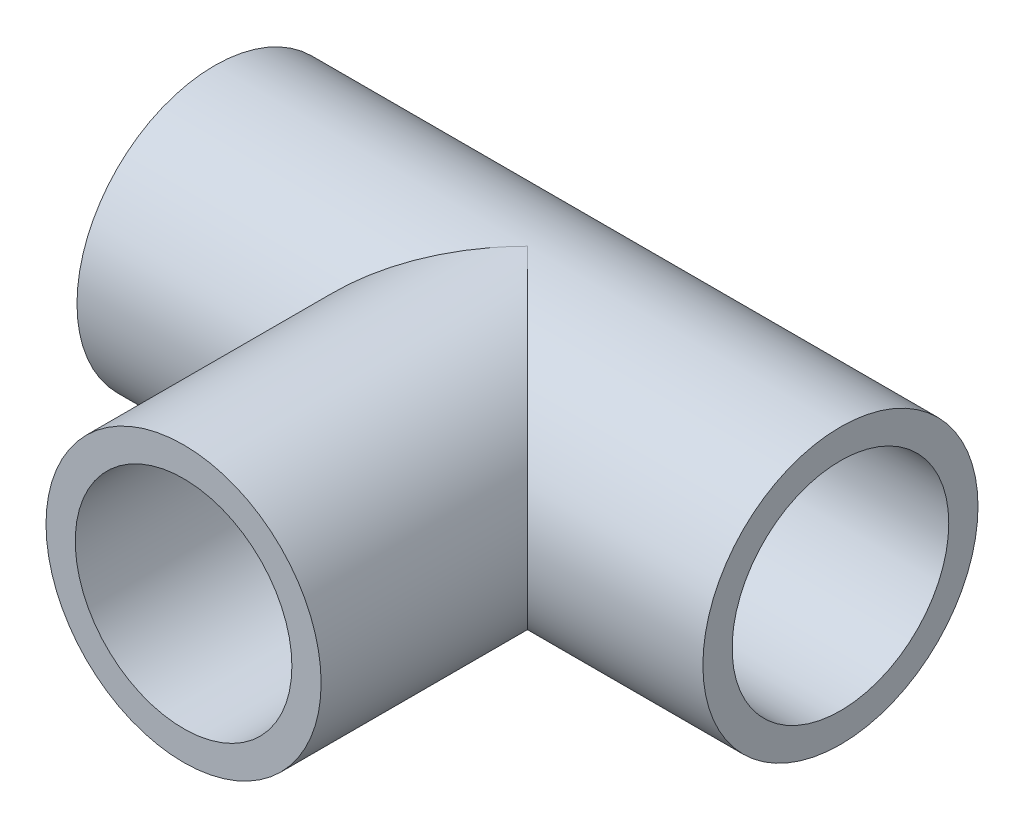
ISO-10303-21;
HEADER;
FILE_DESCRIPTION(('STEP AP214'),'2;1');
FILE_NAME('part.step','',(''),(''),'','','');
FILE_SCHEMA(('AUTOMOTIVE_DESIGN { 1 0 10303 214 1 1 1 1 }'));
ENDSEC;
DATA;
#1=APPLICATION_CONTEXT('core data for automotive mechanical design processes');
#2=APPLICATION_PROTOCOL_DEFINITION('international standard','automotive_design',2000,#1);
#3=PRODUCT_CONTEXT('',#1,'mechanical');
#4=PRODUCT('Part','Part','',(#3));
#5=PRODUCT_RELATED_PRODUCT_CATEGORY('part','',(#4));
#6=PRODUCT_DEFINITION_FORMATION('','',#4);
#7=PRODUCT_DEFINITION_CONTEXT('part definition',#1,'design');
#8=PRODUCT_DEFINITION('design','',#6,#7);
#9=PRODUCT_DEFINITION_SHAPE('','',#8);
#10=(LENGTH_UNIT() NAMED_UNIT(*) SI_UNIT(.MILLI.,.METRE.));
#11=(NAMED_UNIT(*) PLANE_ANGLE_UNIT() SI_UNIT($,.RADIAN.));
#12=(NAMED_UNIT(*) SI_UNIT($,.STERADIAN.) SOLID_ANGLE_UNIT());
#13=UNCERTAINTY_MEASURE_WITH_UNIT(LENGTH_MEASURE(1.E-05),#10,'distance_accuracy_value','');
#14=(GEOMETRIC_REPRESENTATION_CONTEXT(3) GLOBAL_UNCERTAINTY_ASSIGNED_CONTEXT((#13)) GLOBAL_UNIT_ASSIGNED_CONTEXT((#10,
#11,#12)) REPRESENTATION_CONTEXT('',''));
#15=CARTESIAN_POINT('',(0.,0.,0.));
#16=DIRECTION('',(0.,0.,1.));
#17=DIRECTION('',(1.,0.,0.));
#18=AXIS2_PLACEMENT_3D('',#15,#16,#17);
#19=CARTESIAN_POINT('',(20.828,0.,0.));
#20=DIRECTION('',(-1.,0.,0.));
#21=DIRECTION('',(0.,0.,1.));
#22=AXIS2_PLACEMENT_3D('',#19,#20,#21);
#23=CYLINDRICAL_SURFACE('',#22,10.16);
#24=CARTESIAN_POINT('',(16.7605947779187,0.,10.16));
#25=CARTESIAN_POINT('',(16.7605944002954,0.161391241346723,10.1599996176825));
#26=CARTESIAN_POINT('',(16.754433717908,0.322790789718704,10.156145885675));
#27=CARTESIAN_POINT('',(16.729876707607,0.644354415626264,10.1408250745722));
#28=CARTESIAN_POINT('',(16.7114750628537,0.80451792569744,10.1293546872003));
#29=CARTESIAN_POINT('',(16.6626623284459,1.12252662910904,10.0990634271864));
#30=CARTESIAN_POINT('',(16.6322343356812,1.28036823372443,10.0802322092615));
#31=CARTESIAN_POINT('',(16.5597694022496,1.59242770082561,10.0356680571734));
#32=CARTESIAN_POINT('',(16.5177275503003,1.74664400023374,10.0099322033027));
#33=CARTESIAN_POINT('',(16.4228159221283,2.04957272785721,9.95231063993946));
#34=CARTESIAN_POINT('',(16.3700062000217,2.19831050144942,9.92045909374325));
#35=CARTESIAN_POINT('',(16.2539936684815,2.49036401772573,9.85120576496748));
#36=CARTESIAN_POINT('',(16.1907868367667,2.63367763549333,9.81380183491171));
#37=CARTESIAN_POINT('',(15.9865342169672,3.0542380525913,9.69442704643847));
#38=CARTESIAN_POINT('',(15.8307481482798,3.32244467888381,9.60522584585825));
#39=CARTESIAN_POINT('',(15.4708402293542,3.85055170753174,9.4066394502615));
#40=CARTESIAN_POINT('',(15.2638518428047,4.10807828753814,9.2962112565507));
#41=CARTESIAN_POINT('',(14.8138166296704,4.58718468482218,9.06937617506233));
#42=CARTESIAN_POINT('',(14.570721349455,4.80871534775535,8.95296139298631));
#43=CARTESIAN_POINT('',(14.1643431841695,5.12510204253121,8.77361737739438));
#44=CARTESIAN_POINT('',(14.0119241786329,5.23335079033469,8.70929929069932));
#45=CARTESIAN_POINT('',(13.6971889095635,5.43653718615812,8.58393321715721));
#46=CARTESIAN_POINT('',(13.5348708004672,5.53147234107311,8.52288584410349));
#47=CARTESIAN_POINT('',(13.0343332511282,5.79484176371887,8.34803536945558));
#48=CARTESIAN_POINT('',(12.6817286604974,5.94246836681296,8.24214962958351));
#49=CARTESIAN_POINT('',(12.0421435793212,6.1434373378491,8.0929202724754));
#50=CARTESIAN_POINT('',(11.7618529204492,6.21130145110373,8.04047898122048));
#51=CARTESIAN_POINT('',(11.3338928922882,6.2841872291058,7.98344924427664));
#52=CARTESIAN_POINT('',(11.1900215461737,6.30366286199754,7.96804581992391));
#53=CARTESIAN_POINT('',(10.9006371515848,6.33273093121257,7.94496621148113));
#54=CARTESIAN_POINT('',(10.7551240806433,6.34232323211514,7.93729013327066));
#55=CARTESIAN_POINT('',(10.4631974061014,6.35146605269709,7.92997533906146));
#56=CARTESIAN_POINT('',(10.3167824387884,6.35098995887407,7.93035792428876));
#57=CARTESIAN_POINT('',(10.0245818271167,6.33994254000738,7.93919255196162));
#58=CARTESIAN_POINT('',(9.87879618601515,6.32937116277919,7.94764463612001));
#59=CARTESIAN_POINT('',(9.58887783318037,6.29829670156941,7.97229268493496));
#60=CARTESIAN_POINT('',(9.44474597804131,6.27778868922969,7.98849249224459));
#61=CARTESIAN_POINT('',(9.15915445883282,6.22715549257305,8.02802307805275));
#62=CARTESIAN_POINT('',(9.01769592512115,6.19702633243869,8.05135680438289));
#63=CARTESIAN_POINT('',(8.6051359888251,6.09440104307634,8.12965069095149));
#64=CARTESIAN_POINT('',(8.33884583372238,6.00888061822782,8.19356930836958));
#65=CARTESIAN_POINT('',(7.82401602555746,5.80593987351644,8.33859378955333));
#66=CARTESIAN_POINT('',(7.57548268992582,5.6885082711291,8.41970572995961));
#67=CARTESIAN_POINT('',(7.05355123131719,5.39976355554762,8.60831410121277));
#68=CARTESIAN_POINT('',(6.7841812076117,5.22248299498425,8.71790878885823));
#69=CARTESIAN_POINT('',(6.40337070990321,4.92853368468656,8.8852666243512));
#70=CARTESIAN_POINT('',(6.28022001931981,4.82578703044639,8.94159247503192));
#71=CARTESIAN_POINT('',(6.04195222798851,4.6111989706204,9.05412077032806));
#72=CARTESIAN_POINT('',(5.92683660952051,4.4993558951574,9.11032319033105));
#73=CARTESIAN_POINT('',(5.68676797594769,4.24770571332284,9.23066282125762));
#74=CARTESIAN_POINT('',(5.56333818232825,4.10633341406342,9.29457449650343));
#75=CARTESIAN_POINT('',(5.32887208907756,3.8123388470347,9.41897753475988));
#76=CARTESIAN_POINT('',(5.21783123715627,3.65972074596649,9.47947015003849));
#77=CARTESIAN_POINT('',(5.0090165783288,3.34384428111201,9.5954473310777));
#78=CARTESIAN_POINT('',(4.91124295446048,3.18058577057409,9.65093182774156));
#79=CARTESIAN_POINT('',(4.73002104724951,2.84430133269493,9.75533353671945));
#80=CARTESIAN_POINT('',(4.64657106436337,2.67127656739131,9.80425152801895));
#81=CARTESIAN_POINT('',(4.49918529128086,2.3261595753537,9.89163965210742));
#82=CARTESIAN_POINT('',(4.4344396043194,2.15452063738748,9.93053106396854));
#83=CARTESIAN_POINT('',(4.31967585346499,1.80473721131534,10.0000152729486));
#84=CARTESIAN_POINT('',(4.26965751610061,1.62659284407747,10.0306082241604));
#85=CARTESIAN_POINT('',(4.18522317840174,1.26553529914827,10.0825216877686));
#86=CARTESIAN_POINT('',(4.15078885099916,1.08262799199508,10.1038530907007));
#87=CARTESIAN_POINT('',(4.09807203434736,0.713632514413428,10.1365976997416));
#88=CARTESIAN_POINT('',(4.0797867860123,0.527544892884876,10.1480126000889));
#89=CARTESIAN_POINT('',(4.06120423516617,0.181913530792013,10.1596172702887));
#90=CARTESIAN_POINT('',(4.05863792049626,0.0225340393082187,10.1612228923538));
#91=CARTESIAN_POINT('',(4.06549330379852,-0.295864839063021,10.1569386946302));
#92=CARTESIAN_POINT('',(4.07491439840698,-0.454884243671194,10.1510492520915));
#93=CARTESIAN_POINT('',(4.10560837829651,-0.771306353489424,10.1319203683525));
#94=CARTESIAN_POINT('',(4.12688010936077,-0.92870921462572,10.1186816429509));
#95=CARTESIAN_POINT('',(4.18097894655038,-1.24075150171756,10.0851754195127));
#96=CARTESIAN_POINT('',(4.21380625647884,-1.39539087888361,10.0649077975091));
#97=CARTESIAN_POINT('',(4.28908023419266,-1.69482730394177,10.0187419959005));
#98=CARTESIAN_POINT('',(4.3310965353309,-1.83977200587618,9.99309736221845));
#99=CARTESIAN_POINT('',(4.42494488211232,-2.12535099549675,9.93628294945843));
#100=CARTESIAN_POINT('',(4.4767800533481,-2.26598389402017,9.90511141123088));
#101=CARTESIAN_POINT('',(4.64625607185008,-2.68025789445218,9.8042027366681));
#102=CARTESIAN_POINT('',(4.7779255082546,-2.94650187543813,9.7270350625769));
#103=CARTESIAN_POINT('',(5.08937981832259,-3.48026554708368,9.54988961817514));
#104=CARTESIAN_POINT('',(5.27267988718216,-3.74520130935617,9.44839565339208));
#105=CARTESIAN_POINT('',(5.67500865885085,-4.24253791443872,9.23578005976674));
#106=CARTESIAN_POINT('',(5.89407705355927,-4.47490207419688,9.12464780033797));
#107=CARTESIAN_POINT('',(6.26357689469361,-4.81227191580091,8.94912787983478));
#108=CARTESIAN_POINT('',(6.40337513277705,-4.92929374460154,8.88504236572704));
#109=CARTESIAN_POINT('',(6.69291357962594,-5.15117782003365,8.7582706179446));
#110=CARTESIAN_POINT('',(6.84265554232145,-5.25603791250305,8.6955846337463));
#111=CARTESIAN_POINT('',(7.30587546114598,-5.5513191312967,8.51245486949091));
#112=CARTESIAN_POINT('',(7.63378560760268,-5.72284228979144,8.39672091167287));
#113=CARTESIAN_POINT('',(8.25012317814324,-5.9784161274694,8.21605015419498));
#114=CARTESIAN_POINT('',(8.53241812575346,-6.07326601355795,8.14555066051495));
#115=CARTESIAN_POINT('',(8.96731976282762,-6.18562104994337,8.06013982417842));
#116=CARTESIAN_POINT('',(9.1141653414436,-6.21808248031759,8.03506235944708));
#117=CARTESIAN_POINT('',(9.41083514808231,-6.27261468980355,7.99256641735014));
#118=CARTESIAN_POINT('',(9.5606580653805,-6.2946899400828,7.97514464448399));
#119=CARTESIAN_POINT('',(9.86314440772094,-6.32819840633659,7.94858261454781));
#120=CARTESIAN_POINT('',(10.0158195072556,-6.33956671220491,7.93949287863959));
#121=CARTESIAN_POINT('',(10.3218667909336,-6.35122619446112,7.93016922910681));
#122=CARTESIAN_POINT('',(10.475238972,-6.35151741969602,7.92993527643055));
#123=CARTESIAN_POINT('',(10.781401440286,-6.34101513117587,7.93833550030994));
#124=CARTESIAN_POINT('',(10.9341915365687,-6.33021824981792,7.94697237105067));
#125=CARTESIAN_POINT('',(11.2378730912249,-6.29773235746428,7.97274067510701));
#126=CARTESIAN_POINT('',(11.3887645763547,-6.27604350014175,7.98987198857582));
#127=CARTESIAN_POINT('',(11.6754423635196,-6.22431742718677,8.03022119494464));
#128=CARTESIAN_POINT('',(11.8114631058511,-6.19509755964247,8.05283455008727));
#129=CARTESIAN_POINT('',(12.0802812854454,-6.1281200808411,8.10391967182224));
#130=CARTESIAN_POINT('',(12.2130776341322,-6.090359629416,8.13239338699092));
#131=CARTESIAN_POINT('',(12.6057142859988,-5.96484525565344,8.2253926541525));
#132=CARTESIAN_POINT('',(12.859937690259,-5.86483336173181,8.29751675478487));
#133=CARTESIAN_POINT('',(13.3854607103112,-5.61861302078057,8.46652949023568));
#134=CARTESIAN_POINT('',(13.6539042674337,-5.46781275954176,8.56549168966964));
#135=CARTESIAN_POINT('',(14.1644197248989,-5.13077722508097,8.77152911320647));
#136=CARTESIAN_POINT('',(14.4064700539576,-4.94451330365353,8.8786108540512));
#137=CARTESIAN_POINT('',(14.7702431225793,-4.62053171098508,9.04959702425712));
#138=CARTESIAN_POINT('',(14.9013442844851,-4.49323140800151,9.11362506927255));
#139=CARTESIAN_POINT('',(15.1524639157932,-4.22736220580114,9.23994807162966));
#140=CARTESIAN_POINT('',(15.2724856618162,-4.08879666110763,9.30224353753071));
#141=CARTESIAN_POINT('',(15.5008128676219,-3.80078678819659,9.42359083700067));
#142=CARTESIAN_POINT('',(15.6091085278049,-3.65133353283941,9.48263993757445));
#143=CARTESIAN_POINT('',(15.8130158243963,-3.34224791318371,9.59594016046553));
#144=CARTESIAN_POINT('',(15.9086261967212,-3.18261453678374,9.65019080443936));
#145=CARTESIAN_POINT('',(16.0863573451109,-2.85363662548469,9.75254281785507));
#146=CARTESIAN_POINT('',(16.1684492081333,-2.68427229492055,9.80063095962985));
#147=CARTESIAN_POINT('',(16.3178099966011,-2.33729619608138,9.88911890965295));
#148=CARTESIAN_POINT('',(16.3850874833653,-2.15968926349613,9.92952315662061));
#149=CARTESIAN_POINT('',(16.5036899737333,-1.79800230102854,10.0013342695171));
#150=CARTESIAN_POINT('',(16.5550579232795,-1.61394121724527,10.0327653392055));
#151=CARTESIAN_POINT('',(16.6411526349932,-1.24067876491441,10.0857222982776));
#152=CARTESIAN_POINT('',(16.6758916709649,-1.0514812968703,10.1072554928168));
#153=CARTESIAN_POINT('',(16.7214552764103,-0.718449212772744,10.1355728878625));
#154=CARTESIAN_POINT('',(16.7361161659047,-0.575325298199017,10.1447160847014));
#155=CARTESIAN_POINT('',(16.7556863869943,-0.28813650079463,10.1569299993426));
#156=CARTESIAN_POINT('',(16.7605951150175,-0.144071560276414,10.1600003412891));
#157=CARTESIAN_POINT('',(16.7605947779187,0.,10.16));
#158=B_SPLINE_CURVE_WITH_KNOTS('',3,(#24,#25,#26,#27,#28,#29,#30,#31,#32,#33,#34,#35,#36,#37,
#38,#39,#40,#41,#42,#43,#44,#45,#46,#47,#48,#49,#50,#51,#52,#53,#54,#55,#56,#57,#58,#59,#60,#61,
#62,#63,#64,#65,#66,#67,#68,#69,#70,#71,#72,#73,#74,#75,#76,#77,#78,#79,#80,#81,#82,#83,#84,#85,
#86,#87,#88,#89,#90,#91,#92,#93,#94,#95,#96,#97,#98,#99,#100,#101,#102,#103,#104,#105,#106,#107,
#108,#109,#110,#111,#112,#113,#114,#115,#116,#117,#118,#119,#120,#121,#122,#123,#124,#125,#126,
#127,#128,#129,#130,#131,#132,#133,#134,#135,#136,#137,#138,#139,#140,#141,#142,#143,#144,#145,
#146,#147,#148,#149,#150,#151,#152,#153,#154,#155,#156,#157),.UNSPECIFIED.,.T.,.F.,(4,2,2,2,2,2,
2,2,2,2,2,2,2,2,2,2,2,2,2,2,2,2,2,2,2,2,2,2,2,2,2,2,2,2,2,2,2,2,2,2,2,2,2,2,2,2,2,2,2,2,2,2,2,2,
2,2,2,2,2,2,2,2,2,2,2,2,4),(0.,0.484025973625351,0.96826232045046,1.45318169878329,
1.93830645513644,2.42079617209022,2.90347298848562,3.86774876601941,4.90903099379829,
5.95172341040233,6.54416958022081,7.13672654386007,8.31862658056516,9.19407742161865,
9.63158949728497,10.0691075676306,10.5077822612934,10.9464592225651,11.3853539812749,
11.8244303428982,12.6815916946961,13.539056499885,14.5567015281642,15.0663286950033,
15.5760496288253,16.1700980830477,16.7639275315077,17.3577651717479,17.9515323025682,
18.5132659340585,19.0749891340869,19.6360500102143,20.1970150099922,20.6746305516963,
21.1522220544713,21.6297670493825,22.1073204670681,22.5660424697461,23.0249107412796,
23.9419418966557,24.9515376454097,25.9622614475361,26.5414175872914,27.1206761546068,
28.2773168859333,29.1914991123514,29.6484015804187,30.1051071752465,30.5645640237038,
31.0240188460766,31.4836132521631,31.9432011740874,32.3656077955231,32.7881550952005,
33.6328360716765,34.5998026784322,35.5675537587651,36.1478805541708,36.728035170483,
37.3086709450476,37.8893645363359,38.471284407909,39.0528670966358,39.6328659052805,
40.2124359540585,40.6444920006926,41.0765747869245),.UNSPECIFIED.);
#159=CARTESIAN_POINT('',(16.7605947779187,0.,10.16));
#160=VERTEX_POINT('',#159);
#161=EDGE_CURVE('E63',#160,#160,#158,.T.);
#162=ORIENTED_EDGE('',*,*,#161,.T.);
#163=EDGE_LOOP('',(#162));
#164=FACE_BOUND('',#163,.T.);
#165=CARTESIAN_POINT('',(4.12960723085499,0.,10.16));
#166=CARTESIAN_POINT('',(4.12960802116777,-0.15993577458811,10.1599992390968));
#167=CARTESIAN_POINT('',(4.13572457852729,-0.319888660713194,10.1562147263093));
#168=CARTESIAN_POINT('',(4.16010805356437,-0.638574802455996,10.1411680558022));
#169=CARTESIAN_POINT('',(4.17838075299075,-0.797307441337451,10.1299023398499));
#170=CARTESIAN_POINT('',(4.22685766606973,-1.11250294598901,10.1001501666463));
#171=CARTESIAN_POINT('',(4.25708030017271,-1.26896191911489,10.081652562161));
#172=CARTESIAN_POINT('',(4.32906294842989,-1.57829292282104,10.037878741426));
#173=CARTESIAN_POINT('',(4.37082785618535,-1.73116340208831,10.012599650149));
#174=CARTESIAN_POINT('',(4.46512318553312,-2.03145228615812,9.95600380506411));
#175=CARTESIAN_POINT('',(4.51759384998898,-2.1788958116562,9.92472061991553));
#176=CARTESIAN_POINT('',(4.63287290440117,-2.4684095990622,9.85670886460573));
#177=CARTESIAN_POINT('',(4.69568529229089,-2.61047775672099,9.8199781890849));
#178=CARTESIAN_POINT('',(4.89867945715204,-3.02737042427953,9.70276878524531));
#179=CARTESIAN_POINT('',(5.05352920145414,-3.2932315284874,9.61520434179558));
#180=CARTESIAN_POINT('',(5.41119084893829,-3.81643587564488,9.42043350354484));
#181=CARTESIAN_POINT('',(5.61682451532371,-4.07144875263182,9.31222208948931));
#182=CARTESIAN_POINT('',(6.06395729915542,-4.54575291977994,9.09012110939169));
#183=CARTESIAN_POINT('',(6.30550401841802,-4.764995976501,8.9762241424571));
#184=CARTESIAN_POINT('',(6.7088295925019,-5.07757472328927,8.80117527028408));
#185=CARTESIAN_POINT('',(6.85978599883998,-5.1842857495574,8.73856563773374));
#186=CARTESIAN_POINT('',(7.17145188223699,-5.38452565653084,8.61662452149608));
#187=CARTESIAN_POINT('',(7.33216311824149,-5.47805214970037,8.55729363272336));
#188=CARTESIAN_POINT('',(7.82764622286346,-5.73739540504167,8.38751986668234));
#189=CARTESIAN_POINT('',(8.17655759577542,-5.88259218467857,8.28493329195481));
#190=CARTESIAN_POINT('',(8.81080831829488,-6.08045352993199,8.14032348131292));
#191=CARTESIAN_POINT('',(9.08973359915288,-6.14726214332176,8.08953186806262));
#192=CARTESIAN_POINT('',(9.51543606776853,-6.21854048123552,8.0346855388286));
#193=CARTESIAN_POINT('',(9.65852360928172,-6.23747650818635,8.01996117391002));
#194=CARTESIAN_POINT('',(9.94626963239794,-6.265467076094,7.99811616817104));
#195=CARTESIAN_POINT('',(10.090928137162,-6.27452147116381,7.99099563960957));
#196=CARTESIAN_POINT('',(10.3810500050463,-6.28259881206795,7.98464613684881));
#197=CARTESIAN_POINT('',(10.5265144713281,-6.28159717119417,7.98543650454074));
#198=CARTESIAN_POINT('',(10.816762541615,-6.26952401189685,7.99491884370192));
#199=CARTESIAN_POINT('',(10.9615461421088,-6.25845244159817,8.00361085587642));
#200=CARTESIAN_POINT('',(11.249422845616,-6.22640764557374,8.02856518489811));
#201=CARTESIAN_POINT('',(11.3925150947926,-6.20542962075053,8.04483117083895));
#202=CARTESIAN_POINT('',(11.6760064858361,-6.15388739364835,8.0843251288713));
#203=CARTESIAN_POINT('',(11.8164044922234,-6.12331923987617,8.10755597056954));
#204=CARTESIAN_POINT('',(12.2266234882066,-6.01923565790584,8.18546677475882));
#205=CARTESIAN_POINT('',(12.4915811585379,-5.93263090176895,8.24895472372877));
#206=CARTESIAN_POINT('',(13.0036254610711,-5.72741982425269,8.39272839475857));
#207=CARTESIAN_POINT('',(13.2507056770571,-5.60880208495449,8.47302010783855));
#208=CARTESIAN_POINT('',(13.7685239187696,-5.31777012857931,8.65920765466185));
#209=CARTESIAN_POINT('',(14.0352729268325,-5.1394767830406,8.7670976363122));
#210=CARTESIAN_POINT('',(14.4120035748108,-4.8440761515878,8.93159121523558));
#211=CARTESIAN_POINT('',(14.5337680947526,-4.74085705778601,8.98691001917841));
#212=CARTESIAN_POINT('',(14.7692001167682,-4.52535301410151,9.09733038226723));
#213=CARTESIAN_POINT('',(14.8828661363584,-4.41306641233675,9.15243189990252));
#214=CARTESIAN_POINT('',(15.1189147224205,-4.1613491765351,9.26989727256174));
#215=CARTESIAN_POINT('',(15.2398328142571,-4.02043417609053,9.33203148110657));
#216=CARTESIAN_POINT('',(15.469312100046,-3.72756925085358,9.45282526314153));
#217=CARTESIAN_POINT('',(15.5778779096565,-3.57562348290734,9.51148613055397));
#218=CARTESIAN_POINT('',(15.7817777312319,-3.26133131016456,9.62378102802186));
#219=CARTESIAN_POINT('',(15.8771121031274,-3.09898518846117,9.67741519480415));
#220=CARTESIAN_POINT('',(16.0535091627853,-2.76478026964291,9.77814068662648));
#221=CARTESIAN_POINT('',(16.1345735734909,-2.59292262423933,9.8252328014034));
#222=CARTESIAN_POINT('',(16.2771836850689,-2.25084409594552,9.90901230216308));
#223=CARTESIAN_POINT('',(16.339576416791,-2.08108452788122,9.94613869791903));
#224=CARTESIAN_POINT('',(16.4498231431708,-1.73534935247323,10.0122488230572));
#225=CARTESIAN_POINT('',(16.4976774530629,-1.5593738800004,10.0412327289907));
#226=CARTESIAN_POINT('',(16.5780201718972,-1.20291688928445,10.0901395479062));
#227=CARTESIAN_POINT('',(16.6105258542472,-1.02244067827086,10.1100726457298));
#228=CARTESIAN_POINT('',(16.65965931931,-0.658549024399193,10.1402773173163));
#229=CARTESIAN_POINT('',(16.6762896762796,-0.475134062979127,10.1505504574815));
#230=CARTESIAN_POINT('',(16.6921257534749,-0.134005174878137,10.1603346905228));
#231=CARTESIAN_POINT('',(16.6935107457274,0.0235739619413553,10.1611917406578));
#232=CARTESIAN_POINT('',(16.6844417144483,0.338259743355267,10.1555864579262));
#233=CARTESIAN_POINT('',(16.6739882271465,0.495366409027326,10.1491244565797));
#234=CARTESIAN_POINT('',(16.6413907638156,0.807879011624514,10.1290399420582));
#235=CARTESIAN_POINT('',(16.6192478197263,0.963285097440122,10.1154180609547));
#236=CARTESIAN_POINT('',(16.563573819265,1.27127761288607,10.0813423102994));
#237=CARTESIAN_POINT('',(16.5300425366794,1.42386398644327,10.0608883050372));
#238=CARTESIAN_POINT('',(16.4533854591575,1.71989245852474,10.0144504085506));
#239=CARTESIAN_POINT('',(16.410638500995,1.86346743307218,9.98868625806985));
#240=CARTESIAN_POINT('',(16.3153938516224,2.14626276565049,9.93176714431547));
#241=CARTESIAN_POINT('',(16.2628930447239,2.28548171557925,9.90061045871333));
#242=CARTESIAN_POINT('',(16.0915154958586,2.69546838241958,9.79995083599633));
#243=CARTESIAN_POINT('',(15.9587050169343,2.958788938767,9.72322196310829));
#244=CARTESIAN_POINT('',(15.6449289318805,3.48659976541549,9.54748447078252));
#245=CARTESIAN_POINT('',(15.4604341372232,3.74847193957534,9.4470018795236));
#246=CARTESIAN_POINT('',(15.0558425607861,4.23955057319233,9.23705272134115));
#247=CARTESIAN_POINT('',(14.8357054926282,4.46871951024364,9.127576058233));
#248=CARTESIAN_POINT('',(14.4650663413843,4.8004956091764,8.95540970134675));
#249=CARTESIAN_POINT('',(14.3251931433168,4.91522831439536,8.89279186692336));
#250=CARTESIAN_POINT('',(14.0356155388867,5.13252574818702,8.76917400050083));
#251=CARTESIAN_POINT('',(13.8859094133553,5.23508834011758,8.70817425403613));
#252=CARTESIAN_POINT('',(13.4230073714705,5.5234169955918,8.53043091127508));
#253=CARTESIAN_POINT('',(13.0955569509034,5.6902466623794,8.4187135555499));
#254=CARTESIAN_POINT('',(12.4817102836626,5.93684225754477,8.24605014706339));
#255=CARTESIAN_POINT('',(12.2013551517006,6.02757230816149,8.17936064983916));
#256=CARTESIAN_POINT('',(11.7700055834142,6.13390359968503,8.09955148846309));
#257=CARTESIAN_POINT('',(11.6244480200148,6.16438379232135,8.07632175449225));
#258=CARTESIAN_POINT('',(11.330583194388,6.21503210929101,8.03741344057988));
#259=CARTESIAN_POINT('',(11.1822771163904,6.23520457249606,8.02173168360133));
#260=CARTESIAN_POINT('',(10.8831535931636,6.26499874248077,7.99848420423748));
#261=CARTESIAN_POINT('',(10.7323268787309,6.27456250080745,7.99096306281557));
#262=CARTESIAN_POINT('',(10.4301892381235,6.2827745753501,7.98450830952382));
#263=CARTESIAN_POINT('',(10.2788783130108,6.28142291549224,7.9855746788305));
#264=CARTESIAN_POINT('',(9.97699980136985,6.26782571716181,7.99625121041963));
#265=CARTESIAN_POINT('',(9.82643250614306,6.25557620484297,8.0058644892882));
#266=CARTESIAN_POINT('',(9.52731156002107,6.22039357711518,8.03323080967781));
#267=CARTESIAN_POINT('',(9.37875789237865,6.19746055061644,8.05098378345878));
#268=CARTESIAN_POINT('',(9.09525997293376,6.14328974828651,8.09238295013665));
#269=CARTESIAN_POINT('',(8.96010310921069,6.11276454235724,8.11551589857293));
#270=CARTESIAN_POINT('',(8.69309997611333,6.04318379581337,8.16746048786873));
#271=CARTESIAN_POINT('',(8.56125482920495,6.004125405344,8.19627402557819));
#272=CARTESIAN_POINT('',(8.17158499194839,5.87473223002094,8.29002307791423));
#273=CARTESIAN_POINT('',(7.91948774986839,5.77215252771415,8.36228859795936));
#274=CARTESIAN_POINT('',(7.39800154048108,5.52006345032109,8.53116212403408));
#275=CARTESIAN_POINT('',(7.13157488031945,5.36585552110056,8.6297898905785));
#276=CARTESIAN_POINT('',(6.62562728667078,5.02179582128894,8.83443352667355));
#277=CARTESIAN_POINT('',(6.38612871692734,4.83191476866301,8.9404554203654));
#278=CARTESIAN_POINT('',(6.02805361727312,4.50300295012383,9.10865613631019));
#279=CARTESIAN_POINT('',(5.89978954598249,4.37452606126018,9.1711999350601));
#280=CARTESIAN_POINT('',(5.65445444753309,4.10644901371172,9.29432095644298));
#281=CARTESIAN_POINT('',(5.53737995911015,3.96685231936399,9.35489878335398));
#282=CARTESIAN_POINT('',(5.31508916121221,3.67695767086696,9.47259624004773));
#283=CARTESIAN_POINT('',(5.20988206061768,3.52665155196317,9.52971316854455));
#284=CARTESIAN_POINT('',(5.01230202310774,3.21607054423099,9.63896176564881));
#285=CARTESIAN_POINT('',(4.91993022822562,3.05579477017761,9.69109299052015));
#286=CARTESIAN_POINT('',(4.74965985076001,2.72737472086703,9.78857210797145));
#287=CARTESIAN_POINT('',(4.67165813648672,2.55929830109852,9.83396784159516));
#288=CARTESIAN_POINT('',(4.53032877718703,2.21535857132067,9.9171093891764));
#289=CARTESIAN_POINT('',(4.46699261499644,2.03949985200669,9.95485964171766));
#290=CARTESIAN_POINT('',(4.35606457332149,1.68179538311796,10.0214854201264));
#291=CARTESIAN_POINT('',(4.3084291976547,1.4999677346275,10.0503854478968));
#292=CARTESIAN_POINT('',(4.22952588189981,1.13164187239222,10.0984862560856));
#293=CARTESIAN_POINT('',(4.19824543362725,0.945147342587661,10.1176944483876));
#294=CARTESIAN_POINT('',(4.16019700221257,0.631905103162265,10.1411110814773));
#295=CARTESIAN_POINT('',(4.14873645439083,0.50591697930005,10.1481836053463));
#296=CARTESIAN_POINT('',(4.13344102800678,0.25328950600334,10.1576285062794));
#297=CARTESIAN_POINT('',(4.12960660502124,0.126650118116068,10.1600006025449));
#298=CARTESIAN_POINT('',(4.12960723085499,0.,10.16));
#299=B_SPLINE_CURVE_WITH_KNOTS('',3,(#165,#166,#167,#168,#169,#170,#171,#172,#173,#174,#175,
#176,#177,#178,#179,#180,#181,#182,#183,#184,#185,#186,#187,#188,#189,#190,#191,#192,#193,#194,
#195,#196,#197,#198,#199,#200,#201,#202,#203,#204,#205,#206,#207,#208,#209,#210,#211,#212,#213,
#214,#215,#216,#217,#218,#219,#220,#221,#222,#223,#224,#225,#226,#227,#228,#229,#230,#231,#232,
#233,#234,#235,#236,#237,#238,#239,#240,#241,#242,#243,#244,#245,#246,#247,#248,#249,#250,#251,
#252,#253,#254,#255,#256,#257,#258,#259,#260,#261,#262,#263,#264,#265,#266,#267,#268,#269,#270,
#271,#272,#273,#274,#275,#276,#277,#278,#279,#280,#281,#282,#283,#284,#285,#286,#287,#288,#289,
#290,#291,#292,#293,#294,#295,#296,#297,#298),.UNSPECIFIED.,.T.,.F.,(4,2,2,2,2,2,2,2,2,2,2,2,2,
2,2,2,2,2,2,2,2,2,2,2,2,2,2,2,2,2,2,2,2,2,2,2,2,2,2,2,2,2,2,2,2,2,2,2,2,2,2,2,2,2,2,2,2,2,2,2,2,
2,2,2,2,2,4),(0.,0.479676638476249,0.959581585779111,1.44022919369783,1.92108089621397,
2.39931861832243,2.87774165492684,3.8334842529069,4.86469675825699,5.89728849967092,
6.48217356491417,7.06716440903563,8.23399100270853,9.10392090197776,9.53869406375882,
9.97347364420686,10.4093165061437,10.8451616133329,11.2812180789111,11.7174544526221,
12.5715999630604,13.4260505210522,14.4374262763404,14.9439106387278,15.4504874794568,
16.0371803344556,16.6236532358071,17.210110180396,17.7964962680289,18.3495812348902,
18.9026542084392,19.4551032591022,20.0074627123922,20.4796268856034,20.9517696727573,
21.4238707863326,21.8959812780882,22.3514907261601,22.8071459293411,23.7177635140872,
24.7212263048199,25.7258313284365,26.2995615143586,26.8733922784763,28.0190583997201,
28.9215194475222,29.3725800645241,29.8234506581346,30.2767721191034,30.7300925864095,
31.1835784224934,31.6370604846511,32.0580582717528,32.4791968763459,33.3210511811486,
34.2874932338286,35.2547320775156,35.8302109732734,36.4055112765644,36.9812549753752,
37.5570498687603,38.1285360437625,38.6996894853946,39.2692470839993,39.8383684476525,
40.2181926251701,40.5980394923078),.UNSPECIFIED.);
#300=CARTESIAN_POINT('',(4.12960723085499,0.,10.16));
#301=VERTEX_POINT('',#300);
#302=EDGE_CURVE('E38',#301,#301,#299,.T.);
#303=ORIENTED_EDGE('',*,*,#302,.F.);
#304=EDGE_LOOP('',(#303));
#305=FACE_BOUND('',#304,.T.);
#306=ADVANCED_FACE('F34',(#164,#305),#23,.T.);
#307=CARTESIAN_POINT('',(10.4105947779187,0.,0.));
#308=DIRECTION('',(-0.707106781186547,0.,-0.707106781186547));
#309=DIRECTION('',(-0.707106781186547,0.,0.707106781186547));
#310=AXIS2_PLACEMENT_3D('',#307,#308,#309);
#311=ELLIPSE('',#310,14.3684097937107,10.16);
#312=CARTESIAN_POINT('',(10.4105947779187,10.16,0.));
#313=VERTEX_POINT('',#312);
#314=CARTESIAN_POINT('',(10.4105947779187,-10.16,0.));
#315=VERTEX_POINT('',#314);
#316=EDGE_CURVE('E55',#313,#315,#311,.F.);
#317=ORIENTED_EDGE('',*,*,#316,.F.);
#318=CARTESIAN_POINT('',(10.4105947779187,0.,0.));
#319=DIRECTION('',(-0.707106781186547,0.,0.707106781186547));
#320=DIRECTION('',(-0.707106781186547,0.,-0.707106781186547));
#321=AXIS2_PLACEMENT_3D('',#318,#319,#320);
#322=ELLIPSE('',#321,14.3684097937107,10.16);
#323=EDGE_CURVE('E53',#315,#313,#322,.T.);
#324=ORIENTED_EDGE('',*,*,#323,.F.);
#325=EDGE_LOOP('',(#317,#324));
#326=FACE_BOUND('',#325,.T.);
#327=CARTESIAN_POINT('',(-12.7,0.,0.));
#328=DIRECTION('',(-1.,0.,0.));
#329=DIRECTION('',(0.,0.,1.));
#330=AXIS2_PLACEMENT_3D('',#327,#328,#329);
#331=CIRCLE('',#330,10.16);
#332=CARTESIAN_POINT('',(-12.7,0.,10.16));
#333=VERTEX_POINT('',#332);
#334=EDGE_CURVE('E270',#333,#333,#331,.T.);
#335=ORIENTED_EDGE('',*,*,#334,.F.);
#336=EDGE_LOOP('',(#335));
#337=FACE_BOUND('',#336,.T.);
#338=CARTESIAN_POINT('',(33.528,0.,0.));
#339=DIRECTION('',(1.,0.,0.));
#340=DIRECTION('',(0.,0.,-1.));
#341=AXIS2_PLACEMENT_3D('',#338,#339,#340);
#342=CIRCLE('',#341,10.16);
#343=CARTESIAN_POINT('',(33.528,0.,-10.16));
#344=VERTEX_POINT('',#343);
#345=EDGE_CURVE('E267',#344,#344,#342,.T.);
#346=ORIENTED_EDGE('',*,*,#345,.F.);
#347=EDGE_LOOP('',(#346));
#348=FACE_BOUND('',#347,.T.);
#349=ADVANCED_FACE('F56',(#326,#337,#348),#23,.T.);
#350=CARTESIAN_POINT('',(20.828,0.,0.));
#351=DIRECTION('',(-1.,0.,0.));
#352=DIRECTION('',(0.,0.,1.));
#353=AXIS2_PLACEMENT_3D('',#350,#351,#352);
#354=CYLINDRICAL_SURFACE('',#353,6.35);
#355=CARTESIAN_POINT('',(0.,0.,0.));
#356=DIRECTION('',(1.,0.,0.));
#357=DIRECTION('',(0.,0.,-1.));
#358=AXIS2_PLACEMENT_3D('',#355,#356,#357);
#359=CIRCLE('',#358,6.35);
#360=CARTESIAN_POINT('',(0.,0.,-6.35));
#361=VERTEX_POINT('',#360);
#362=EDGE_CURVE('E59',#361,#361,#359,.T.);
#363=ORIENTED_EDGE('',*,*,#362,.F.);
#364=EDGE_LOOP('',(#363));
#365=FACE_BOUND('',#364,.T.);
#366=CARTESIAN_POINT('',(20.828,0.,0.));
#367=DIRECTION('',(1.,0.,0.));
#368=DIRECTION('',(0.,0.,-1.));
#369=AXIS2_PLACEMENT_3D('',#366,#367,#368);
#370=CIRCLE('',#369,6.35);
#371=CARTESIAN_POINT('',(20.828,0.,-6.35));
#372=VERTEX_POINT('',#371);
#373=EDGE_CURVE('E74',#372,#372,#370,.T.);
#374=ORIENTED_EDGE('',*,*,#373,.T.);
#375=EDGE_LOOP('',(#374));
#376=FACE_BOUND('',#375,.T.);
#377=CARTESIAN_POINT('',(4.12960723085499,0.,6.35));
#378=CARTESIAN_POINT('',(4.12960230189717,-0.140706169343039,6.35000492354349));
#379=CARTESIAN_POINT('',(4.13434125138473,-0.281370670660338,6.34531732792605));
#380=CARTESIAN_POINT('',(4.15318218091358,-0.561500470905517,6.32668204986781));
#381=CARTESIAN_POINT('',(4.16728616298899,-0.700965506955592,6.31273238740469));
#382=CARTESIAN_POINT('',(4.20457439270811,-0.977553413996397,6.27585666364959));
#383=CARTESIAN_POINT('',(4.22776464079408,-1.11467467461243,6.25292467055588));
#384=CARTESIAN_POINT('',(4.28276724593203,-1.38551052363318,6.19854407736995));
#385=CARTESIAN_POINT('',(4.31458361089654,-1.51922349678794,6.16709151841242));
#386=CARTESIAN_POINT('',(4.3859901371276,-1.78136609643645,6.09651762789294));
#387=CARTESIAN_POINT('',(4.4255226189319,-1.90982685531031,6.05745319997576));
#388=CARTESIAN_POINT('',(4.51186858713966,-2.16185032496594,5.97215381573472));
#389=CARTESIAN_POINT('',(4.55868480099778,-2.28541117909847,5.925916173359));
#390=CARTESIAN_POINT('',(4.70901359422854,-2.64785151598696,5.77749684299827));
#391=CARTESIAN_POINT('',(4.82246211442324,-2.87868795156899,5.66555357391912));
#392=CARTESIAN_POINT('',(5.12147531645112,-3.40615644528569,5.37080962390625));
#393=CARTESIAN_POINT('',(5.31755677707438,-3.69107871727979,5.17775519418885));
#394=CARTESIAN_POINT('',(5.63435592719193,-4.08248969532962,4.86659672059196));
#395=CARTESIAN_POINT('',(5.74396287118116,-4.20716510655713,4.75905829214521));
#396=CARTESIAN_POINT('',(5.96968964842961,-4.44477036474707,4.53793114537696));
#397=CARTESIAN_POINT('',(6.08580944667427,-4.55770027484661,4.42434245958315));
#398=CARTESIAN_POINT('',(6.36922636823007,-4.81323825518371,4.14765891480916));
#399=CARTESIAN_POINT('',(6.53905340507692,-4.9505911190991,3.98230263963677));
#400=CARTESIAN_POINT('',(6.88735613027459,-5.20423269739055,3.64459405929871));
#401=CARTESIAN_POINT('',(7.06583615926261,-5.32051069837532,3.47223825011391));
#402=CARTESIAN_POINT('',(7.42945407972122,-5.53242515619171,3.12350157304361));
#403=CARTESIAN_POINT('',(7.61456638263112,-5.62813268383743,2.94713697016864));
#404=CARTESIAN_POINT('',(7.99142813434638,-5.80011997779812,2.59227105063422));
#405=CARTESIAN_POINT('',(8.18317377684658,-5.87641068241589,2.41377099657131));
#406=CARTESIAN_POINT('',(8.5060235161905,-5.98677296827804,2.12045836544906));
#407=CARTESIAN_POINT('',(8.63489485323799,-6.02628041691449,2.00519517117827));
#408=CARTESIAN_POINT('',(8.8979435169124,-6.09766146676561,1.77634321247573));
#409=CARTESIAN_POINT('',(9.0321517703633,-6.12947946206664,1.66277191065629));
#410=CARTESIAN_POINT('',(9.23982122922911,-6.17131619367565,1.49689606703529));
#411=CARTESIAN_POINT('',(9.31060123061234,-6.1843472526733,1.44199771358532));
#412=CARTESIAN_POINT('',(9.4549592791927,-6.20829603127628,1.33512172935476));
#413=CARTESIAN_POINT('',(9.52854290240012,-6.2192092447765,1.28315048963846));
#414=CARTESIAN_POINT('',(9.67856514647917,-6.23863806535816,1.18505553298291));
#415=CARTESIAN_POINT('',(9.75495779715437,-6.24718138456394,1.13886802768382));
#416=CARTESIAN_POINT('',(9.91281811714,-6.26172966128396,1.05593142351133));
#417=CARTESIAN_POINT('',(9.99425905303376,-6.2677468649793,1.01913713659696));
#418=CARTESIAN_POINT('',(10.1327247212293,-6.27506968559148,0.972806553362016));
#419=CARTESIAN_POINT('',(10.187942077359,-6.27729210409588,0.958225028488766));
#420=CARTESIAN_POINT('',(10.2999842143393,-6.28026155909762,0.938573838342432));
#421=CARTESIAN_POINT('',(10.3568024440951,-6.28101391362561,0.933469890796685));
#422=CARTESIAN_POINT('',(10.4705778014642,-6.28095965664953,0.933832979301359));
#423=CARTESIAN_POINT('',(10.5275348161433,-6.28014822354068,0.939332709547749));
#424=CARTESIAN_POINT('',(10.6397881616544,-6.27705727870809,0.959769701310069));
#425=CARTESIAN_POINT('',(10.6950778452174,-6.27477254143781,0.974740551603482));
#426=CARTESIAN_POINT('',(10.8641875431817,-6.26565292209063,1.03226553712139));
#427=CARTESIAN_POINT('',(10.9735675115982,-6.2565935721731,1.0868743940337));
#428=CARTESIAN_POINT('',(11.1842622369801,-6.2340674451622,1.2095117454698));
#429=CARTESIAN_POINT('',(11.2854974020646,-6.2205625215017,1.27765428796348));
#430=CARTESIAN_POINT('',(11.482714011629,-6.18960767786218,1.42006244649958));
#431=CARTESIAN_POINT('',(11.5787029039941,-6.17216354093752,1.49431898621341));
#432=CARTESIAN_POINT('',(11.7673548290123,-6.13345545794399,1.64602193463769));
#433=CARTESIAN_POINT('',(11.8600156284413,-6.11218900242054,1.7234704130412));
#434=CARTESIAN_POINT('',(12.1348378728635,-6.04265044881607,1.95844270364886));
#435=CARTESIAN_POINT('',(12.3135401787287,-5.98868767314725,2.11835985983047));
#436=CARTESIAN_POINT('',(12.6646690443486,-5.86552702108518,2.4387876820676));
#437=CARTESIAN_POINT('',(12.8371011596564,-5.79634303427215,2.59929767670036));
#438=CARTESIAN_POINT('',(13.1763150891558,-5.6423631974281,2.91849171722915));
#439=CARTESIAN_POINT('',(13.3431018787214,-5.55758154186994,3.07717728503229));
#440=CARTESIAN_POINT('',(13.6712311116324,-5.3716541467554,3.39134708068275));
#441=CARTESIAN_POINT('',(13.8325620948165,-5.27047626916382,3.54682433115028));
#442=CARTESIAN_POINT('',(14.1486369034342,-5.05122335145216,3.8526700402257));
#443=CARTESIAN_POINT('',(14.3033782768964,-4.93314209170332,4.0030365930311));
#444=CARTESIAN_POINT('',(14.6046685601964,-4.67965967386968,4.2966045073782));
#445=CARTESIAN_POINT('',(14.7512315713039,-4.54428974015066,4.43981815431882));
#446=CARTESIAN_POINT('',(15.0346223145172,-4.25559728670249,4.71725497404321));
#447=CARTESIAN_POINT('',(15.1714552714974,-4.10228452080326,4.85148296966593));
#448=CARTESIAN_POINT('',(15.4782799922599,-3.72126619556812,5.15286710343046));
#449=CARTESIAN_POINT('',(15.6435987976465,-3.48605478413691,5.31557630700357));
#450=CARTESIAN_POINT('',(15.8703329205093,-3.10863781379357,5.53897765534743));
#451=CARTESIAN_POINT('',(15.9423669755793,-2.97873983372741,5.60999776253024));
#452=CARTESIAN_POINT('',(16.0784003119438,-2.71095936162812,5.74417869830358));
#453=CARTESIAN_POINT('',(16.1424042918093,-2.57308160840587,5.80734412264569));
#454=CARTESIAN_POINT('',(16.2516485954641,-2.31288553586305,5.9151959141473));
#455=CARTESIAN_POINT('',(16.2982473098773,-2.19168816694393,5.96121656427636));
#456=CARTESIAN_POINT('',(16.3844343252355,-1.944520716704,6.04635505038864));
#457=CARTESIAN_POINT('',(16.4240259802674,-1.81855295408599,6.08547618894692));
#458=CARTESIAN_POINT('',(16.4956059508763,-1.5624099793162,6.15621853274809));
#459=CARTESIAN_POINT('',(16.527594403874,-1.43223484325706,6.18783987354278));
#460=CARTESIAN_POINT('',(16.583400694824,-1.16851466222882,6.24301295383253));
#461=CARTESIAN_POINT('',(16.6072220000832,-1.03497107322904,6.266568117763));
#462=CARTESIAN_POINT('',(16.6463666780111,-0.764659687430922,6.30527859102195));
#463=CARTESIAN_POINT('',(16.6616421152992,-0.627878102184614,6.32038651793983));
#464=CARTESIAN_POINT('',(16.6831758971068,-0.352911654752279,6.34168485497128));
#465=CARTESIAN_POINT('',(16.6894342219819,-0.214726789509745,6.34787524565724));
#466=CARTESIAN_POINT('',(16.6928000320844,0.0618400494543201,6.35120447081497));
#467=CARTESIAN_POINT('',(16.6899090574958,0.200221986081107,6.34834482876012));
#468=CARTESIAN_POINT('',(16.6750410634526,0.476009594676437,6.33363888236946));
#469=CARTESIAN_POINT('',(16.6630644715258,0.613415312274327,6.32179300088512));
#470=CARTESIAN_POINT('',(16.6316957134497,0.874332420196228,6.2907700185531));
#471=CARTESIAN_POINT('',(16.6130330985089,0.998019132434834,6.27231421121031));
#472=CARTESIAN_POINT('',(16.5686375763809,1.24290138674783,6.22841677657476));
#473=CARTESIAN_POINT('',(16.5429020314748,1.36409598127362,6.20297254307934));
#474=CARTESIAN_POINT('',(16.4847587207399,1.60327308928523,6.14549784015168));
#475=CARTESIAN_POINT('',(16.4523508704908,1.72125556210873,6.11346728738694));
#476=CARTESIAN_POINT('',(16.3813153785411,1.95347190593595,6.04327479423573));
#477=CARTESIAN_POINT('',(16.342686487652,2.0677050185085,6.00511162241914));
#478=CARTESIAN_POINT('',(16.2466696472537,2.32716379641672,5.91027851042609));
#479=CARTESIAN_POINT('',(16.1871974913084,2.47087687248865,5.85155768326138));
#480=CARTESIAN_POINT('',(16.0594813479478,2.75036942691543,5.72551392836086));
#481=CARTESIAN_POINT('',(15.9912351204366,2.8861468663123,5.65818880390014));
#482=CARTESIAN_POINT('',(15.7747814649535,3.28122321683102,5.44477780467129));
#483=CARTESIAN_POINT('',(15.6148941571676,3.5281742815042,5.28729099875021));
#484=CARTESIAN_POINT('',(15.3270727781547,3.9136962115057,5.00429845305606));
#485=CARTESIAN_POINT('',(15.2053587565032,4.06160955275347,4.88475643305501));
#486=CARTESIAN_POINT('',(14.9529252322168,4.3420733178003,4.63722414765183));
#487=CARTESIAN_POINT('',(14.8222019418758,4.47461721633093,4.50923032987601));
#488=CARTESIAN_POINT('',(14.5529067362841,4.72503964906597,4.24612883082319));
#489=CARTESIAN_POINT('',(14.4143102294202,4.84286808883713,4.11099896469563));
#490=CARTESIAN_POINT('',(14.1309078882572,5.06382667029677,3.83553480489346));
#491=CARTESIAN_POINT('',(13.9861041487905,5.16696172072859,3.69520226915599));
#492=CARTESIAN_POINT('',(13.6444230164746,5.38951792804719,3.36551114703079));
#493=CARTESIAN_POINT('',(13.4455652559383,5.50376778084907,3.17468884461226));
#494=CARTESIAN_POINT('',(13.1410376500347,5.65759986503401,2.88548555896122));
#495=CARTESIAN_POINT('',(13.038380147061,5.70599390969332,2.78848881681587));
#496=CARTESIAN_POINT('',(12.8310117634402,5.79700010310856,2.59399469478172));
#497=CARTESIAN_POINT('',(12.7263012071567,5.83961315691685,2.49649739574463));
#498=CARTESIAN_POINT('',(12.5152446571776,5.91894409694321,2.30207860267778));
#499=CARTESIAN_POINT('',(12.4089101064465,5.95569170014235,2.20515676817333));
#500=CARTESIAN_POINT('',(12.1936374105373,6.02364677463569,2.0121231303509));
#501=CARTESIAN_POINT('',(12.0846978616531,6.05485117899833,1.91601180330524));
#502=CARTESIAN_POINT('',(11.8638110740076,6.11162291408614,1.72636492251906));
#503=CARTESIAN_POINT('',(11.7518747424158,6.13720820864861,1.632822022407));
#504=CARTESIAN_POINT('',(11.5230561674438,6.18279063339376,1.45062228625656));
#505=CARTESIAN_POINT('',(11.4061803328612,6.20279476323978,1.36195944296352));
#506=CARTESIAN_POINT('',(11.2119199049606,6.23009503348803,1.22924471639361));
#507=CARTESIAN_POINT('',(11.1373603509174,6.23927847699589,1.18149627017109));
#508=CARTESIAN_POINT('',(10.9836058220119,6.25527229540544,1.0936303526493));
#509=CARTESIAN_POINT('',(10.9044220806393,6.26208816287954,1.05349531850304));
#510=CARTESIAN_POINT('',(10.7673775456929,6.27108572288942,0.998250152693135));
#511=CARTESIAN_POINT('',(10.7111902853553,6.27405477093506,0.979256909368645));
#512=CARTESIAN_POINT('',(10.5965081436961,6.2784958660502,0.950373228705271));
#513=CARTESIAN_POINT('',(10.5380208103277,6.27997244411352,0.940455248486443));
#514=CARTESIAN_POINT('',(10.4196133325096,6.28126161928982,0.931815823377218));
#515=CARTESIAN_POINT('',(10.3596850336373,6.28105913608966,0.933195848936925));
#516=CARTESIAN_POINT('',(10.241142178157,6.27898301265086,0.9470544498978));
#517=CARTESIAN_POINT('',(10.1825303494665,6.27710618119184,0.959554218820925));
#518=CARTESIAN_POINT('',(10.0404869546259,6.27064984862737,1.001023625765));
#519=CARTESIAN_POINT('',(9.95863848167079,6.26520570593952,1.03501777294361));
#520=CARTESIAN_POINT('',(9.80013087346956,6.25176206220178,1.11335789565838));
#521=CARTESIAN_POINT('',(9.72350427929535,6.24374804935699,1.15776226420737));
#522=CARTESIAN_POINT('',(9.57285171116322,6.22533780033987,1.25302580609257));
#523=CARTESIAN_POINT('',(9.49889446204278,6.21490243026298,1.30398410478289));
#524=CARTESIAN_POINT('',(9.3537634330318,6.19187399854008,1.40929779535782));
#525=CARTESIAN_POINT('',(9.28259158354275,6.1792794719291,1.46365547767708));
#526=CARTESIAN_POINT('',(9.07174059418164,6.13831157587965,1.6299119516994));
#527=CARTESIAN_POINT('',(8.93502729239265,6.10679234546512,1.74478527809109));
#528=CARTESIAN_POINT('',(8.66583917552192,6.03539597108691,1.97774931294007));
#529=CARTESIAN_POINT('',(8.5333808566088,5.99548998132617,2.09584986887004));
#530=CARTESIAN_POINT('',(8.27216396880998,5.90735907686052,2.33271472025728));
#531=CARTESIAN_POINT('',(8.14340140179114,5.85914358024499,2.45147811856453));
#532=CARTESIAN_POINT('',(7.81560289740791,5.72397703683851,2.75687025515721));
#533=CARTESIAN_POINT('',(7.61882352275046,5.63071400720368,2.9431744876713));
#534=CARTESIAN_POINT('',(7.23279722302734,5.42222526048243,3.31162636117597));
#535=CARTESIAN_POINT('',(7.0435563702093,5.30698225440928,3.49377060286637));
#536=CARTESIAN_POINT('',(6.6745929019304,5.0540040679987,3.85061248635631));
#537=CARTESIAN_POINT('',(6.49484175430759,4.91634207522686,4.02533210091072));
#538=CARTESIAN_POINT('',(6.14641392741248,4.61738228261471,4.36502545298916));
#539=CARTESIAN_POINT('',(5.97772829599619,4.45610393886925,4.53000705758215));
#540=CARTESIAN_POINT('',(5.61855537794344,4.0707378729535,4.88198632659112));
#541=CARTESIAN_POINT('',(5.43138381087065,3.8406299601087,5.06589287313581));
#542=CARTESIAN_POINT('',(5.08453381390978,3.34300345233588,5.4071874418622));
#543=CARTESIAN_POINT('',(4.92482506983339,3.07552670518264,5.5646046994552));
#544=CARTESIAN_POINT('',(4.66679261622529,2.55503076485978,5.81915778832368));
#545=CARTESIAN_POINT('',(4.56260902351661,2.30780373084338,5.92203005887874));
#546=CARTESIAN_POINT('',(4.42924478670932,1.92167590690363,6.05377539124197));
#547=CARTESIAN_POINT('',(4.38861638407918,1.79045594762893,6.09392225460614));
#548=CARTESIAN_POINT('',(4.31562328843641,1.52356635092393,6.16606372456714));
#549=CARTESIAN_POINT('',(4.28325670966835,1.38789773688803,6.19806019148274));
#550=CARTESIAN_POINT('',(4.21410064195068,1.04742612465035,6.26643408345696));
#551=CARTESIAN_POINT('',(4.18254402475542,0.8404650737606,6.29764258118176));
#552=CARTESIAN_POINT('',(4.14030043129361,0.422304908583837,6.33942242490702));
#553=CARTESIAN_POINT('',(4.12961462591373,0.211105557192716,6.34999261306454));
#554=CARTESIAN_POINT('',(4.12960723085499,0.,6.35));
#555=B_SPLINE_CURVE_WITH_KNOTS('',3,(#377,#378,#379,#380,#381,#382,#383,#384,#385,#386,#387,
#388,#389,#390,#391,#392,#393,#394,#395,#396,#397,#398,#399,#400,#401,#402,#403,#404,#405,#406,
#407,#408,#409,#410,#411,#412,#413,#414,#415,#416,#417,#418,#419,#420,#421,#422,#423,#424,#425,
#426,#427,#428,#429,#430,#431,#432,#433,#434,#435,#436,#437,#438,#439,#440,#441,#442,#443,#444,
#445,#446,#447,#448,#449,#450,#451,#452,#453,#454,#455,#456,#457,#458,#459,#460,#461,#462,#463,
#464,#465,#466,#467,#468,#469,#470,#471,#472,#473,#474,#475,#476,#477,#478,#479,#480,#481,#482,
#483,#484,#485,#486,#487,#488,#489,#490,#491,#492,#493,#494,#495,#496,#497,#498,#499,#500,#501,
#502,#503,#504,#505,#506,#507,#508,#509,#510,#511,#512,#513,#514,#515,#516,#517,#518,#519,#520,
#521,#522,#523,#524,#525,#526,#527,#528,#529,#530,#531,#532,#533,#534,#535,#536,#537,#538,#539,
#540,#541,#542,#543,#544,#545,#546,#547,#548,#549,#550,#551,#552,#553,#554),.UNSPECIFIED.,.T.,
.F.,(4,2,2,2,2,2,2,2,2,2,2,2,2,2,2,2,2,2,2,2,2,2,2,2,2,2,2,2,2,2,2,2,2,2,2,2,2,2,2,2,2,2,2,2,2,
2,2,2,2,2,2,2,2,2,2,2,2,2,2,2,2,2,2,2,2,2,2,2,2,2,2,2,2,2,2,2,2,2,2,2,2,2,2,2,2,2,2,2,4),(0.,
0.421890531604913,0.843871283002511,1.26613117551671,1.68858759789616,2.10799931816894,
2.52756847036951,3.36607182896525,4.54756153821228,5.14054214679619,5.7335195676903,
6.55419436245222,7.37528518364075,8.1934918409707,9.0112365431531,9.543121520382,
10.0787448353577,10.3502286792696,10.6222839697205,10.8910092506455,11.1584163179136,
11.3292259974908,11.4994166119773,11.6701328124612,11.841457868248,12.2063284401431,
12.5744152642104,12.9419651829034,13.3097572953105,14.0464856812353,14.7825445595436,
15.517936880193,16.2547884676545,16.991911881178,17.7277223500224,18.4631346697573,
19.4501643263042,19.9436260460822,20.4367976706227,20.8496853878423,21.2623749293455,
21.6750570113046,22.0875636743136,22.5023615428702,22.9171603150988,23.3318892642362,
23.7465986993304,24.1255016897392,24.5045461772385,24.8835954608418,25.2627209528827,
25.7607178414475,26.2588421263251,27.2553996873166,27.9320328050557,28.6089521512023,
29.2881164515569,29.9670533230751,30.8607986889105,31.3085877791382,31.7563066839203,
32.2016798411492,32.6472986513587,33.0914714189768,33.5350845936057,33.8019001167703,
34.068092450794,34.245698109644,34.4227629406557,34.6014197716886,34.7804178425227,
35.0452917195957,35.3116884600857,35.5827343804858,35.8539649358281,36.3975284453325,
36.9429930383938,37.4878434134114,38.3466231622044,39.2060812158754,40.062787800618,
40.9187925261491,41.9622614728229,43.0045711122906,43.8627643765048,44.2916313151343,
44.720400277481,45.3533394015005,45.9863140334205),.UNSPECIFIED.);
#556=CARTESIAN_POINT('',(4.12960723085499,0.,6.35));
#557=VERTEX_POINT('',#556);
#558=EDGE_CURVE('E98',#557,#557,#555,.T.);
#559=ORIENTED_EDGE('',*,*,#558,.T.);
#560=EDGE_LOOP('',(#559));
#561=FACE_BOUND('',#560,.T.);
#562=ADVANCED_FACE('F88',(#365,#376,#561),#354,.F.);
#563=CARTESIAN_POINT('',(20.828,0.,0.));
#564=DIRECTION('',(1.,0.,0.));
#565=DIRECTION('',(0.,0.,-1.));
#566=AXIS2_PLACEMENT_3D('',#563,#564,#565);
#567=PLANE('',#566);
#568=CARTESIAN_POINT('',(20.828,0.,0.));
#569=DIRECTION('',(1.,0.,0.));
#570=DIRECTION('',(0.,0.,-1.));
#571=AXIS2_PLACEMENT_3D('',#568,#569,#570);
#572=CIRCLE('',#571,8.001);
#573=CARTESIAN_POINT('',(20.828,0.,-8.001));
#574=VERTEX_POINT('',#573);
#575=EDGE_CURVE('E47',#574,#574,#572,.F.);
#576=ORIENTED_EDGE('',*,*,#575,.F.);
#577=EDGE_LOOP('',(#576));
#578=FACE_BOUND('',#577,.T.);
#579=ORIENTED_EDGE('',*,*,#373,.F.);
#580=EDGE_LOOP('',(#579));
#581=FACE_BOUND('',#580,.T.);
#582=ADVANCED_FACE('F84',(#578,#581),#567,.T.);
#583=CARTESIAN_POINT('',(0.,0.,0.));
#584=DIRECTION('',(1.,0.,0.));
#585=DIRECTION('',(0.,0.,-1.));
#586=AXIS2_PLACEMENT_3D('',#583,#584,#585);
#587=PLANE('',#586);
#588=CARTESIAN_POINT('',(0.,0.,0.));
#589=DIRECTION('',(-1.,0.,0.));
#590=DIRECTION('',(0.,0.,1.));
#591=AXIS2_PLACEMENT_3D('',#588,#589,#590);
#592=CIRCLE('',#591,8.001);
#593=CARTESIAN_POINT('',(0.,0.,8.001));
#594=VERTEX_POINT('',#593);
#595=EDGE_CURVE('E263',#594,#594,#592,.T.);
#596=ORIENTED_EDGE('',*,*,#595,.T.);
#597=EDGE_LOOP('',(#596));
#598=FACE_BOUND('',#597,.T.);
#599=ORIENTED_EDGE('',*,*,#362,.T.);
#600=EDGE_LOOP('',(#599));
#601=FACE_BOUND('',#600,.T.);
#602=ADVANCED_FACE('F87',(#598,#601),#587,.F.);
#603=CARTESIAN_POINT('',(10.4105947779187,0.,12.7));
#604=DIRECTION('',(0.,0.,-1.));
#605=DIRECTION('',(-1.,0.,0.));
#606=AXIS2_PLACEMENT_3D('',#603,#604,#605);
#607=CYLINDRICAL_SURFACE('',#606,10.16);
#608=ORIENTED_EDGE('',*,*,#323,.T.);
#609=ORIENTED_EDGE('',*,*,#316,.T.);
#610=EDGE_LOOP('',(#608,#609));
#611=FACE_BOUND('',#610,.T.);
#612=CARTESIAN_POINT('',(10.4105947779187,0.,25.4));
#613=DIRECTION('',(0.,0.,1.));
#614=DIRECTION('',(1.,0.,0.));
#615=AXIS2_PLACEMENT_3D('',#612,#613,#614);
#616=CIRCLE('',#615,10.16);
#617=CARTESIAN_POINT('',(20.5705947779187,0.,25.4));
#618=VERTEX_POINT('',#617);
#619=EDGE_CURVE('E103',#618,#618,#616,.T.);
#620=ORIENTED_EDGE('',*,*,#619,.F.);
#621=EDGE_LOOP('',(#620));
#622=FACE_BOUND('',#621,.T.);
#623=ADVANCED_FACE('F61',(#611,#622),#607,.T.);
#624=CARTESIAN_POINT('',(-12.7,0.,0.));
#625=DIRECTION('',(-1.,0.,0.));
#626=DIRECTION('',(0.,0.,1.));
#627=AXIS2_PLACEMENT_3D('',#624,#625,#626);
#628=PLANE('',#627);
#629=ORIENTED_EDGE('',*,*,#334,.T.);
#630=EDGE_LOOP('',(#629));
#631=FACE_BOUND('',#630,.T.);
#632=CARTESIAN_POINT('',(-12.7,0.,0.));
#633=DIRECTION('',(-1.,0.,0.));
#634=DIRECTION('',(0.,0.,1.));
#635=AXIS2_PLACEMENT_3D('',#632,#633,#634);
#636=CIRCLE('',#635,8.001);
#637=CARTESIAN_POINT('',(-12.7,0.,8.001));
#638=VERTEX_POINT('',#637);
#639=EDGE_CURVE('E266',#638,#638,#636,.T.);
#640=ORIENTED_EDGE('',*,*,#639,.F.);
#641=EDGE_LOOP('',(#640));
#642=FACE_BOUND('',#641,.T.);
#643=ADVANCED_FACE('F137',(#631,#642),#628,.T.);
#644=CARTESIAN_POINT('',(-12.7,0.,0.));
#645=DIRECTION('',(1.,0.,0.));
#646=DIRECTION('',(0.,0.,-1.));
#647=AXIS2_PLACEMENT_3D('',#644,#645,#646);
#648=CYLINDRICAL_SURFACE('',#647,8.001);
#649=ORIENTED_EDGE('',*,*,#639,.T.);
#650=EDGE_LOOP('',(#649));
#651=FACE_BOUND('',#650,.T.);
#652=ORIENTED_EDGE('',*,*,#595,.F.);
#653=EDGE_LOOP('',(#652));
#654=FACE_BOUND('',#653,.T.);
#655=ADVANCED_FACE('F133',(#651,#654),#648,.F.);
#656=CARTESIAN_POINT('',(33.528,0.,0.));
#657=DIRECTION('',(1.,0.,0.));
#658=DIRECTION('',(0.,0.,-1.));
#659=AXIS2_PLACEMENT_3D('',#656,#657,#658);
#660=PLANE('',#659);
#661=ORIENTED_EDGE('',*,*,#345,.T.);
#662=EDGE_LOOP('',(#661));
#663=FACE_BOUND('',#662,.T.);
#664=CARTESIAN_POINT('',(33.528,0.,0.));
#665=DIRECTION('',(1.,0.,0.));
#666=DIRECTION('',(0.,0.,-1.));
#667=AXIS2_PLACEMENT_3D('',#664,#665,#666);
#668=CIRCLE('',#667,8.001);
#669=CARTESIAN_POINT('',(33.528,0.,-8.001));
#670=VERTEX_POINT('',#669);
#671=EDGE_CURVE('E273',#670,#670,#668,.T.);
#672=ORIENTED_EDGE('',*,*,#671,.F.);
#673=EDGE_LOOP('',(#672));
#674=FACE_BOUND('',#673,.T.);
#675=ADVANCED_FACE('F129',(#663,#674),#660,.T.);
#676=CARTESIAN_POINT('',(33.528,0.,0.));
#677=DIRECTION('',(-1.,0.,0.));
#678=DIRECTION('',(0.,0.,1.));
#679=AXIS2_PLACEMENT_3D('',#676,#677,#678);
#680=CYLINDRICAL_SURFACE('',#679,8.001);
#681=ORIENTED_EDGE('',*,*,#671,.T.);
#682=EDGE_LOOP('',(#681));
#683=FACE_BOUND('',#682,.T.);
#684=ORIENTED_EDGE('',*,*,#575,.T.);
#685=EDGE_LOOP('',(#684));
#686=FACE_BOUND('',#685,.T.);
#687=ADVANCED_FACE('F82',(#683,#686),#680,.F.);
#688=CARTESIAN_POINT('',(10.4105947779187,0.,25.4));
#689=DIRECTION('',(0.,0.,1.));
#690=DIRECTION('',(1.,0.,0.));
#691=AXIS2_PLACEMENT_3D('',#688,#689,#690);
#692=PLANE('',#691);
#693=ORIENTED_EDGE('',*,*,#619,.T.);
#694=EDGE_LOOP('',(#693));
#695=FACE_BOUND('',#694,.T.);
#696=CARTESIAN_POINT('',(10.4105947779187,0.,25.4));
#697=DIRECTION('',(0.,0.,1.));
#698=DIRECTION('',(1.,0.,0.));
#699=AXIS2_PLACEMENT_3D('',#696,#697,#698);
#700=CIRCLE('',#699,8.001);
#701=CARTESIAN_POINT('',(18.4115947779187,0.,25.4));
#702=VERTEX_POINT('',#701);
#703=EDGE_CURVE('E100',#702,#702,#700,.T.);
#704=ORIENTED_EDGE('',*,*,#703,.F.);
#705=EDGE_LOOP('',(#704));
#706=FACE_BOUND('',#705,.T.);
#707=ADVANCED_FACE('F122',(#695,#706),#692,.T.);
#708=CARTESIAN_POINT('',(10.4105947779187,0.,25.4));
#709=DIRECTION('',(0.,0.,-1.));
#710=DIRECTION('',(-1.,0.,0.));
#711=AXIS2_PLACEMENT_3D('',#708,#709,#710);
#712=CYLINDRICAL_SURFACE('',#711,8.001);
#713=ORIENTED_EDGE('',*,*,#703,.T.);
#714=EDGE_LOOP('',(#713));
#715=FACE_BOUND('',#714,.T.);
#716=CARTESIAN_POINT('',(10.4105947779187,0.,12.7));
#717=DIRECTION('',(0.,0.,1.));
#718=DIRECTION('',(1.,0.,0.));
#719=AXIS2_PLACEMENT_3D('',#716,#717,#718);
#720=CIRCLE('',#719,8.001);
#721=CARTESIAN_POINT('',(18.4115947779187,0.,12.7));
#722=VERTEX_POINT('',#721);
#723=EDGE_CURVE('E11',#722,#722,#720,.F.);
#724=ORIENTED_EDGE('',*,*,#723,.T.);
#725=EDGE_LOOP('',(#724));
#726=FACE_BOUND('',#725,.T.);
#727=ADVANCED_FACE('F117',(#715,#726),#712,.F.);
#728=CARTESIAN_POINT('',(10.4105947779187,0.,12.7));
#729=DIRECTION('',(0.,0.,-1.));
#730=DIRECTION('',(-1.,0.,0.));
#731=AXIS2_PLACEMENT_3D('',#728,#729,#730);
#732=CYLINDRICAL_SURFACE('',#731,6.35);
#733=CARTESIAN_POINT('',(10.4105947779187,0.,12.7));
#734=DIRECTION('',(0.,0.,1.));
#735=DIRECTION('',(1.,0.,0.));
#736=AXIS2_PLACEMENT_3D('',#733,#734,#735);
#737=CIRCLE('',#736,6.35);
#738=CARTESIAN_POINT('',(16.7605947779187,0.,12.7));
#739=VERTEX_POINT('',#738);
#740=EDGE_CURVE('E66',#739,#739,#737,.T.);
#741=ORIENTED_EDGE('',*,*,#740,.T.);
#742=EDGE_LOOP('',(#741));
#743=FACE_BOUND('',#742,.T.);
#744=ORIENTED_EDGE('',*,*,#161,.F.);
#745=EDGE_LOOP('',(#744));
#746=FACE_BOUND('',#745,.T.);
#747=ADVANCED_FACE('F121',(#743,#746),#732,.F.);
#748=CARTESIAN_POINT('',(10.4105947779187,0.,12.7));
#749=DIRECTION('',(0.,0.,1.));
#750=DIRECTION('',(1.,0.,0.));
#751=AXIS2_PLACEMENT_3D('',#748,#749,#750);
#752=PLANE('',#751);
#753=ORIENTED_EDGE('',*,*,#723,.F.);
#754=EDGE_LOOP('',(#753));
#755=FACE_BOUND('',#754,.T.);
#756=ORIENTED_EDGE('',*,*,#740,.F.);
#757=EDGE_LOOP('',(#756));
#758=FACE_BOUND('',#757,.T.);
#759=ADVANCED_FACE('F116',(#755,#758),#752,.T.);
#760=CARTESIAN_POINT('',(10.4105947779187,0.,15.24));
#761=DIRECTION('',(0.,0.,-1.));
#762=DIRECTION('',(-1.,0.,0.));
#763=AXIS2_PLACEMENT_3D('',#760,#761,#762);
#764=CYLINDRICAL_SURFACE('',#763,6.28098754706373);
#765=ORIENTED_EDGE('',*,*,#558,.F.);
#766=EDGE_LOOP('',(#765));
#767=FACE_BOUND('',#766,.T.);
#768=ORIENTED_EDGE('',*,*,#302,.T.);
#769=EDGE_LOOP('',(#768));
#770=FACE_BOUND('',#769,.T.);
#771=ADVANCED_FACE('F112',(#767,#770),#764,.F.);
#772=CLOSED_SHELL('',(#306,#349,#562,#582,#602,#623,#643,#655,#675,#687,#707,#727,#747,#759,#771));
#773=MANIFOLD_SOLID_BREP('B2',#772);
#774=ADVANCED_BREP_SHAPE_REPRESENTATION('',(#18,#773),#14);
#775=SHAPE_DEFINITION_REPRESENTATION(#9,#774);
ENDSEC;
END-ISO-10303-21;
